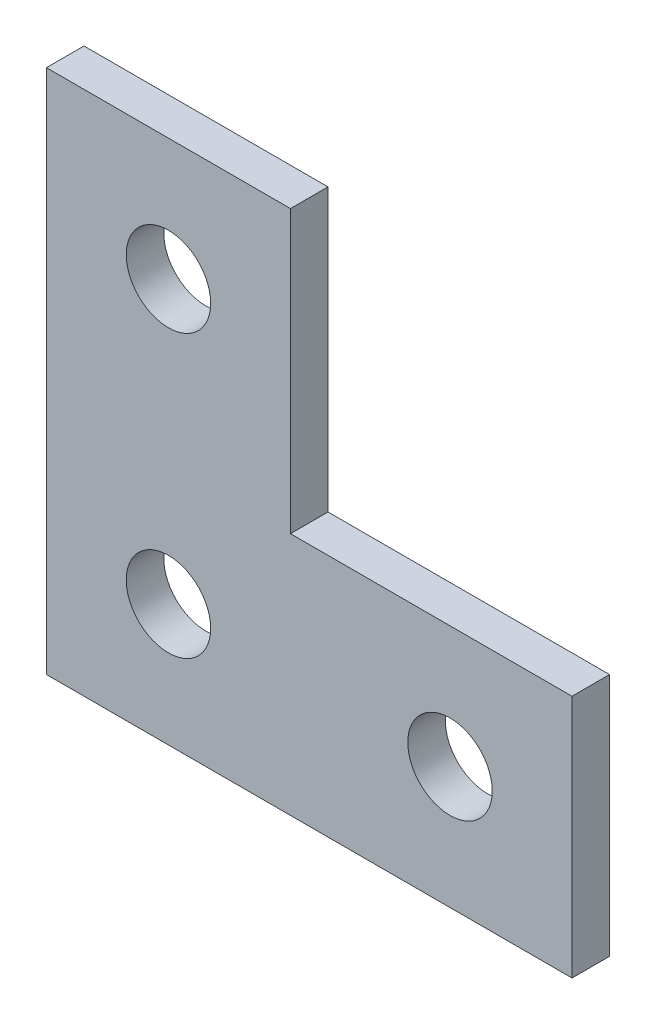
ISO-10303-21;
HEADER;
FILE_DESCRIPTION(('STEP AP214'),'2;1');
FILE_NAME('part.step','',(''),(''),'','','');
FILE_SCHEMA(('AUTOMOTIVE_DESIGN { 1 0 10303 214 1 1 1 1 }'));
ENDSEC;
DATA;
#1=APPLICATION_CONTEXT('core data for automotive mechanical design processes');
#2=APPLICATION_PROTOCOL_DEFINITION('international standard','automotive_design',2000,#1);
#3=PRODUCT_CONTEXT('',#1,'mechanical');
#4=PRODUCT('Part','Part','',(#3));
#5=PRODUCT_RELATED_PRODUCT_CATEGORY('part','',(#4));
#6=PRODUCT_DEFINITION_FORMATION('','',#4);
#7=PRODUCT_DEFINITION_CONTEXT('part definition',#1,'design');
#8=PRODUCT_DEFINITION('design','',#6,#7);
#9=PRODUCT_DEFINITION_SHAPE('','',#8);
#10=(LENGTH_UNIT() NAMED_UNIT(*) SI_UNIT(.MILLI.,.METRE.));
#11=(NAMED_UNIT(*) PLANE_ANGLE_UNIT() SI_UNIT($,.RADIAN.));
#12=(NAMED_UNIT(*) SI_UNIT($,.STERADIAN.) SOLID_ANGLE_UNIT());
#13=UNCERTAINTY_MEASURE_WITH_UNIT(LENGTH_MEASURE(1.E-05),#10,'distance_accuracy_value','');
#14=(GEOMETRIC_REPRESENTATION_CONTEXT(3) GLOBAL_UNCERTAINTY_ASSIGNED_CONTEXT((#13)) GLOBAL_UNIT_ASSIGNED_CONTEXT((#10,
#11,#12)) REPRESENTATION_CONTEXT('',''));
#15=CARTESIAN_POINT('',(0.,0.,0.));
#16=DIRECTION('',(0.,0.,1.));
#17=DIRECTION('',(1.,0.,0.));
#18=AXIS2_PLACEMENT_3D('',#15,#16,#17);
#19=CARTESIAN_POINT('',(0.,88.9,3.175));
#20=DIRECTION('',(0.,0.,1.));
#21=DIRECTION('',(1.,0.,0.));
#22=AXIS2_PLACEMENT_3D('',#19,#20,#21);
#23=PLANE('',#22);
#24=CARTESIAN_POINT('',(20.6375,68.2625,3.175));
#25=DIRECTION('',(0.,0.,1.));
#26=DIRECTION('',(1.,0.,0.));
#27=AXIS2_PLACEMENT_3D('',#24,#25,#26);
#28=CIRCLE('',#27,7.14375);
#29=CARTESIAN_POINT('',(27.78125,68.2625,3.175));
#30=VERTEX_POINT('',#29);
#31=EDGE_CURVE('E186',#30,#30,#28,.T.);
#32=ORIENTED_EDGE('',*,*,#31,.F.);
#33=EDGE_LOOP('',(#32));
#34=FACE_BOUND('',#33,.T.);
#35=DIRECTION('',(-1.,0.,0.));
#36=VECTOR('',#35,1.);
#37=CARTESIAN_POINT('',(41.275,88.9,3.175));
#38=LINE('',#37,#36);
#39=CARTESIAN_POINT('',(41.275,88.9,3.175));
#40=VERTEX_POINT('',#39);
#41=CARTESIAN_POINT('',(0.,88.9,3.175));
#42=VERTEX_POINT('',#41);
#43=EDGE_CURVE('E130',#40,#42,#38,.T.);
#44=ORIENTED_EDGE('',*,*,#43,.T.);
#45=DIRECTION('',(0.,-1.,0.));
#46=VECTOR('',#45,1.);
#47=CARTESIAN_POINT('',(0.,88.9,3.175));
#48=LINE('',#47,#46);
#49=CARTESIAN_POINT('',(0.,0.,3.175));
#50=VERTEX_POINT('',#49);
#51=EDGE_CURVE('E88',#42,#50,#48,.T.);
#52=ORIENTED_EDGE('',*,*,#51,.T.);
#53=DIRECTION('',(1.,0.,0.));
#54=VECTOR('',#53,1.);
#55=CARTESIAN_POINT('',(0.,0.,3.175));
#56=LINE('',#55,#54);
#57=CARTESIAN_POINT('',(88.9,0.,3.175));
#58=VERTEX_POINT('',#57);
#59=EDGE_CURVE('E101',#50,#58,#56,.T.);
#60=ORIENTED_EDGE('',*,*,#59,.T.);
#61=DIRECTION('',(0.,1.,0.));
#62=VECTOR('',#61,1.);
#63=CARTESIAN_POINT('',(88.9,0.,3.175));
#64=LINE('',#63,#62);
#65=CARTESIAN_POINT('',(88.9,41.275,3.175));
#66=VERTEX_POINT('',#65);
#67=EDGE_CURVE('E95',#58,#66,#64,.T.);
#68=ORIENTED_EDGE('',*,*,#67,.T.);
#69=DIRECTION('',(-1.,0.,0.));
#70=VECTOR('',#69,1.);
#71=CARTESIAN_POINT('',(88.9,41.275,3.175));
#72=LINE('',#71,#70);
#73=CARTESIAN_POINT('',(41.275,41.275,3.175));
#74=VERTEX_POINT('',#73);
#75=EDGE_CURVE('E99',#66,#74,#72,.T.);
#76=ORIENTED_EDGE('',*,*,#75,.T.);
#77=DIRECTION('',(0.,1.,0.));
#78=VECTOR('',#77,1.);
#79=CARTESIAN_POINT('',(41.275,41.275,3.175));
#80=LINE('',#79,#78);
#81=EDGE_CURVE('E51',#74,#40,#80,.T.);
#82=ORIENTED_EDGE('',*,*,#81,.T.);
#83=EDGE_LOOP('',(#44,#52,#60,#68,#76,#82));
#84=FACE_BOUND('',#83,.T.);
#85=CARTESIAN_POINT('',(20.6375,20.6375,3.175));
#86=DIRECTION('',(0.,0.,1.));
#87=DIRECTION('',(1.,0.,0.));
#88=AXIS2_PLACEMENT_3D('',#85,#86,#87);
#89=CIRCLE('',#88,7.14375);
#90=CARTESIAN_POINT('',(27.78125,20.6375,3.175));
#91=VERTEX_POINT('',#90);
#92=EDGE_CURVE('E123',#91,#91,#89,.T.);
#93=ORIENTED_EDGE('',*,*,#92,.F.);
#94=EDGE_LOOP('',(#93));
#95=FACE_BOUND('',#94,.T.);
#96=CARTESIAN_POINT('',(68.2625,20.6375,3.175));
#97=DIRECTION('',(0.,0.,1.));
#98=DIRECTION('',(1.,0.,0.));
#99=AXIS2_PLACEMENT_3D('',#96,#97,#98);
#100=CIRCLE('',#99,7.14375);
#101=CARTESIAN_POINT('',(75.40625,20.6375,3.175));
#102=VERTEX_POINT('',#101);
#103=EDGE_CURVE('E177',#102,#102,#100,.T.);
#104=ORIENTED_EDGE('',*,*,#103,.F.);
#105=EDGE_LOOP('',(#104));
#106=FACE_BOUND('',#105,.T.);
#107=ADVANCED_FACE('F34',(#34,#84,#95,#106),#23,.T.);
#108=CARTESIAN_POINT('',(0.,88.9,-3.175));
#109=DIRECTION('',(0.,0.,1.));
#110=DIRECTION('',(1.,0.,0.));
#111=AXIS2_PLACEMENT_3D('',#108,#109,#110);
#112=PLANE('',#111);
#113=CARTESIAN_POINT('',(20.6375,68.2625,-3.175));
#114=DIRECTION('',(0.,0.,1.));
#115=DIRECTION('',(1.,0.,0.));
#116=AXIS2_PLACEMENT_3D('',#113,#114,#115);
#117=CIRCLE('',#116,7.14375);
#118=CARTESIAN_POINT('',(27.78125,68.2625,-3.175));
#119=VERTEX_POINT('',#118);
#120=EDGE_CURVE('E183',#119,#119,#117,.T.);
#121=ORIENTED_EDGE('',*,*,#120,.T.);
#122=EDGE_LOOP('',(#121));
#123=FACE_BOUND('',#122,.T.);
#124=DIRECTION('',(-1.,0.,0.));
#125=VECTOR('',#124,1.);
#126=CARTESIAN_POINT('',(41.275,88.9,-3.175));
#127=LINE('',#126,#125);
#128=CARTESIAN_POINT('',(41.275,88.9,-3.175));
#129=VERTEX_POINT('',#128);
#130=CARTESIAN_POINT('',(0.,88.9,-3.175));
#131=VERTEX_POINT('',#130);
#132=EDGE_CURVE('E119',#129,#131,#127,.T.);
#133=ORIENTED_EDGE('',*,*,#132,.F.);
#134=DIRECTION('',(0.,1.,0.));
#135=VECTOR('',#134,1.);
#136=CARTESIAN_POINT('',(41.275,41.275,-3.175));
#137=LINE('',#136,#135);
#138=CARTESIAN_POINT('',(41.275,41.275,-3.175));
#139=VERTEX_POINT('',#138);
#140=EDGE_CURVE('E80',#139,#129,#137,.T.);
#141=ORIENTED_EDGE('',*,*,#140,.F.);
#142=DIRECTION('',(-1.,0.,0.));
#143=VECTOR('',#142,1.);
#144=CARTESIAN_POINT('',(88.9,41.275,-3.175));
#145=LINE('',#144,#143);
#146=CARTESIAN_POINT('',(88.9,41.275,-3.175));
#147=VERTEX_POINT('',#146);
#148=EDGE_CURVE('E74',#147,#139,#145,.T.);
#149=ORIENTED_EDGE('',*,*,#148,.F.);
#150=DIRECTION('',(0.,1.,0.));
#151=VECTOR('',#150,1.);
#152=CARTESIAN_POINT('',(88.9,0.,-3.175));
#153=LINE('',#152,#151);
#154=CARTESIAN_POINT('',(88.9,0.,-3.175));
#155=VERTEX_POINT('',#154);
#156=EDGE_CURVE('E109',#155,#147,#153,.T.);
#157=ORIENTED_EDGE('',*,*,#156,.F.);
#158=DIRECTION('',(1.,0.,0.));
#159=VECTOR('',#158,1.);
#160=CARTESIAN_POINT('',(0.,0.,-3.175));
#161=LINE('',#160,#159);
#162=CARTESIAN_POINT('',(0.,0.,-3.175));
#163=VERTEX_POINT('',#162);
#164=EDGE_CURVE('E125',#163,#155,#161,.T.);
#165=ORIENTED_EDGE('',*,*,#164,.F.);
#166=DIRECTION('',(0.,-1.,0.));
#167=VECTOR('',#166,1.);
#168=CARTESIAN_POINT('',(0.,88.9,-3.175));
#169=LINE('',#168,#167);
#170=EDGE_CURVE('E122',#131,#163,#169,.T.);
#171=ORIENTED_EDGE('',*,*,#170,.F.);
#172=EDGE_LOOP('',(#133,#141,#149,#157,#165,#171));
#173=FACE_BOUND('',#172,.T.);
#174=CARTESIAN_POINT('',(20.6375,20.6375,-3.175));
#175=DIRECTION('',(0.,0.,1.));
#176=DIRECTION('',(1.,0.,0.));
#177=AXIS2_PLACEMENT_3D('',#174,#175,#176);
#178=CIRCLE('',#177,7.14375);
#179=CARTESIAN_POINT('',(27.78125,20.6375,-3.175));
#180=VERTEX_POINT('',#179);
#181=EDGE_CURVE('E189',#180,#180,#178,.T.);
#182=ORIENTED_EDGE('',*,*,#181,.T.);
#183=EDGE_LOOP('',(#182));
#184=FACE_BOUND('',#183,.T.);
#185=CARTESIAN_POINT('',(68.2625,20.6375,-3.175));
#186=DIRECTION('',(0.,0.,1.));
#187=DIRECTION('',(1.,0.,0.));
#188=AXIS2_PLACEMENT_3D('',#185,#186,#187);
#189=CIRCLE('',#188,7.14375);
#190=CARTESIAN_POINT('',(75.40625,20.6375,-3.175));
#191=VERTEX_POINT('',#190);
#192=EDGE_CURVE('E180',#191,#191,#189,.T.);
#193=ORIENTED_EDGE('',*,*,#192,.T.);
#194=EDGE_LOOP('',(#193));
#195=FACE_BOUND('',#194,.T.);
#196=ADVANCED_FACE('F139',(#123,#173,#184,#195),#112,.F.);
#197=CARTESIAN_POINT('',(41.275,88.9,3.175));
#198=DIRECTION('',(0.,-1.,0.));
#199=DIRECTION('',(0.,0.,-1.));
#200=AXIS2_PLACEMENT_3D('',#197,#198,#199);
#201=PLANE('',#200);
#202=ORIENTED_EDGE('',*,*,#132,.T.);
#203=DIRECTION('',(0.,0.,-1.));
#204=VECTOR('',#203,1.);
#205=CARTESIAN_POINT('',(0.,88.9,3.175));
#206=LINE('',#205,#204);
#207=EDGE_CURVE('E11',#42,#131,#206,.T.);
#208=ORIENTED_EDGE('',*,*,#207,.F.);
#209=ORIENTED_EDGE('',*,*,#43,.F.);
#210=DIRECTION('',(0.,0.,-1.));
#211=VECTOR('',#210,1.);
#212=CARTESIAN_POINT('',(41.275,88.9,3.175));
#213=LINE('',#212,#211);
#214=EDGE_CURVE('E115',#40,#129,#213,.T.);
#215=ORIENTED_EDGE('',*,*,#214,.T.);
#216=EDGE_LOOP('',(#202,#208,#209,#215));
#217=FACE_BOUND('',#216,.T.);
#218=ADVANCED_FACE('F36',(#217),#201,.F.);
#219=CARTESIAN_POINT('',(0.,88.9,3.175));
#220=DIRECTION('',(1.,0.,0.));
#221=DIRECTION('',(0.,0.,-1.));
#222=AXIS2_PLACEMENT_3D('',#219,#220,#221);
#223=PLANE('',#222);
#224=ORIENTED_EDGE('',*,*,#170,.T.);
#225=DIRECTION('',(0.,0.,-1.));
#226=VECTOR('',#225,1.);
#227=CARTESIAN_POINT('',(0.,0.,3.175));
#228=LINE('',#227,#226);
#229=EDGE_CURVE('E43',#50,#163,#228,.T.);
#230=ORIENTED_EDGE('',*,*,#229,.F.);
#231=ORIENTED_EDGE('',*,*,#51,.F.);
#232=ORIENTED_EDGE('',*,*,#207,.T.);
#233=EDGE_LOOP('',(#224,#230,#231,#232));
#234=FACE_BOUND('',#233,.T.);
#235=ADVANCED_FACE('F238',(#234),#223,.F.);
#236=CARTESIAN_POINT('',(0.,0.,3.175));
#237=DIRECTION('',(0.,1.,0.));
#238=DIRECTION('',(0.,0.,1.));
#239=AXIS2_PLACEMENT_3D('',#236,#237,#238);
#240=PLANE('',#239);
#241=ORIENTED_EDGE('',*,*,#164,.T.);
#242=DIRECTION('',(0.,0.,-1.));
#243=VECTOR('',#242,1.);
#244=CARTESIAN_POINT('',(88.9,0.,3.175));
#245=LINE('',#244,#243);
#246=EDGE_CURVE('E110',#58,#155,#245,.T.);
#247=ORIENTED_EDGE('',*,*,#246,.F.);
#248=ORIENTED_EDGE('',*,*,#59,.F.);
#249=ORIENTED_EDGE('',*,*,#229,.T.);
#250=EDGE_LOOP('',(#241,#247,#248,#249));
#251=FACE_BOUND('',#250,.T.);
#252=ADVANCED_FACE('F136',(#251),#240,.F.);
#253=CARTESIAN_POINT('',(88.9,0.,3.175));
#254=DIRECTION('',(-1.,0.,0.));
#255=DIRECTION('',(0.,-1.,0.));
#256=AXIS2_PLACEMENT_3D('',#253,#254,#255);
#257=PLANE('',#256);
#258=ORIENTED_EDGE('',*,*,#156,.T.);
#259=DIRECTION('',(0.,0.,-1.));
#260=VECTOR('',#259,1.);
#261=CARTESIAN_POINT('',(88.9,41.275,3.175));
#262=LINE('',#261,#260);
#263=EDGE_CURVE('E106',#66,#147,#262,.T.);
#264=ORIENTED_EDGE('',*,*,#263,.F.);
#265=ORIENTED_EDGE('',*,*,#67,.F.);
#266=ORIENTED_EDGE('',*,*,#246,.T.);
#267=EDGE_LOOP('',(#258,#264,#265,#266));
#268=FACE_BOUND('',#267,.T.);
#269=ADVANCED_FACE('F107',(#268),#257,.F.);
#270=CARTESIAN_POINT('',(88.9,41.275,3.175));
#271=DIRECTION('',(0.,-1.,0.));
#272=DIRECTION('',(1.,0.,0.));
#273=AXIS2_PLACEMENT_3D('',#270,#271,#272);
#274=PLANE('',#273);
#275=ORIENTED_EDGE('',*,*,#148,.T.);
#276=DIRECTION('',(0.,0.,-1.));
#277=VECTOR('',#276,1.);
#278=CARTESIAN_POINT('',(41.275,41.275,3.175));
#279=LINE('',#278,#277);
#280=EDGE_CURVE('E111',#74,#139,#279,.T.);
#281=ORIENTED_EDGE('',*,*,#280,.F.);
#282=ORIENTED_EDGE('',*,*,#75,.F.);
#283=ORIENTED_EDGE('',*,*,#263,.T.);
#284=EDGE_LOOP('',(#275,#281,#282,#283));
#285=FACE_BOUND('',#284,.T.);
#286=ADVANCED_FACE('F113',(#285),#274,.F.);
#287=CARTESIAN_POINT('',(41.275,41.275,3.175));
#288=DIRECTION('',(-1.,0.,0.));
#289=DIRECTION('',(0.,-1.,0.));
#290=AXIS2_PLACEMENT_3D('',#287,#288,#289);
#291=PLANE('',#290);
#292=ORIENTED_EDGE('',*,*,#140,.T.);
#293=ORIENTED_EDGE('',*,*,#214,.F.);
#294=ORIENTED_EDGE('',*,*,#81,.F.);
#295=ORIENTED_EDGE('',*,*,#280,.T.);
#296=EDGE_LOOP('',(#292,#293,#294,#295));
#297=FACE_BOUND('',#296,.T.);
#298=ADVANCED_FACE('F144',(#297),#291,.F.);
#299=CARTESIAN_POINT('',(20.6375,20.6375,3.175));
#300=DIRECTION('',(0.,0.,-1.));
#301=DIRECTION('',(-1.,0.,0.));
#302=AXIS2_PLACEMENT_3D('',#299,#300,#301);
#303=CYLINDRICAL_SURFACE('',#302,7.14375);
#304=ORIENTED_EDGE('',*,*,#92,.T.);
#305=EDGE_LOOP('',(#304));
#306=FACE_BOUND('',#305,.T.);
#307=ORIENTED_EDGE('',*,*,#181,.F.);
#308=EDGE_LOOP('',(#307));
#309=FACE_BOUND('',#308,.T.);
#310=ADVANCED_FACE('F146',(#306,#309),#303,.F.);
#311=CARTESIAN_POINT('',(20.6375,68.2625,3.175));
#312=DIRECTION('',(0.,0.,-1.));
#313=DIRECTION('',(-1.,0.,0.));
#314=AXIS2_PLACEMENT_3D('',#311,#312,#313);
#315=CYLINDRICAL_SURFACE('',#314,7.14375);
#316=ORIENTED_EDGE('',*,*,#31,.T.);
#317=EDGE_LOOP('',(#316));
#318=FACE_BOUND('',#317,.T.);
#319=ORIENTED_EDGE('',*,*,#120,.F.);
#320=EDGE_LOOP('',(#319));
#321=FACE_BOUND('',#320,.T.);
#322=ADVANCED_FACE('F152',(#318,#321),#315,.F.);
#323=CARTESIAN_POINT('',(68.2625,20.6375,3.175));
#324=DIRECTION('',(0.,0.,-1.));
#325=DIRECTION('',(-1.,0.,0.));
#326=AXIS2_PLACEMENT_3D('',#323,#324,#325);
#327=CYLINDRICAL_SURFACE('',#326,7.14375);
#328=ORIENTED_EDGE('',*,*,#103,.T.);
#329=EDGE_LOOP('',(#328));
#330=FACE_BOUND('',#329,.T.);
#331=ORIENTED_EDGE('',*,*,#192,.F.);
#332=EDGE_LOOP('',(#331));
#333=FACE_BOUND('',#332,.T.);
#334=ADVANCED_FACE('F168',(#330,#333),#327,.F.);
#335=CLOSED_SHELL('',(#107,#196,#218,#235,#252,#269,#286,#298,#310,#322,#334));
#336=MANIFOLD_SOLID_BREP('B2',#335);
#337=ADVANCED_BREP_SHAPE_REPRESENTATION('',(#18,#336),#14);
#338=SHAPE_DEFINITION_REPRESENTATION(#9,#337);
ENDSEC;
END-ISO-10303-21;
